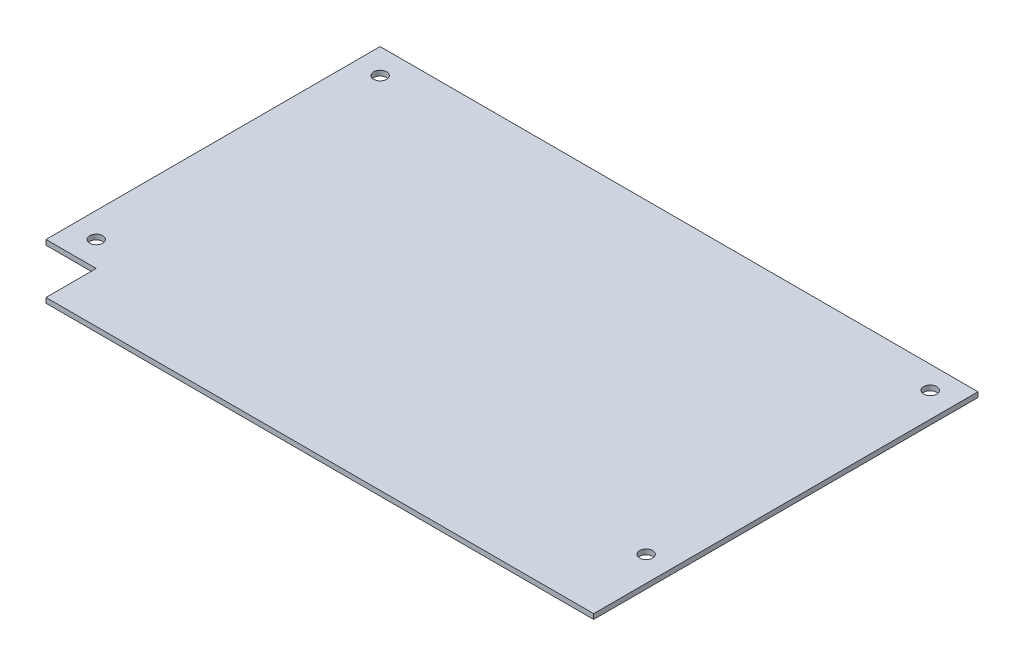
ISO-10303-21;
HEADER;
FILE_DESCRIPTION(('STEP AP214'),'2;1');
FILE_NAME('part.step','',(''),(''),'','','');
FILE_SCHEMA(('AUTOMOTIVE_DESIGN { 1 0 10303 214 1 1 1 1 }'));
ENDSEC;
DATA;
#1=APPLICATION_CONTEXT('core data for automotive mechanical design processes');
#2=APPLICATION_PROTOCOL_DEFINITION('international standard','automotive_design',2000,#1);
#3=PRODUCT_CONTEXT('',#1,'mechanical');
#4=PRODUCT('Part','Part','',(#3));
#5=PRODUCT_RELATED_PRODUCT_CATEGORY('part','',(#4));
#6=PRODUCT_DEFINITION_FORMATION('','',#4);
#7=PRODUCT_DEFINITION_CONTEXT('part definition',#1,'design');
#8=PRODUCT_DEFINITION('design','',#6,#7);
#9=PRODUCT_DEFINITION_SHAPE('','',#8);
#10=(LENGTH_UNIT() NAMED_UNIT(*) SI_UNIT(.MILLI.,.METRE.));
#11=(NAMED_UNIT(*) PLANE_ANGLE_UNIT() SI_UNIT($,.RADIAN.));
#12=(NAMED_UNIT(*) SI_UNIT($,.STERADIAN.) SOLID_ANGLE_UNIT());
#13=UNCERTAINTY_MEASURE_WITH_UNIT(LENGTH_MEASURE(1.E-05),#10,'distance_accuracy_value','');
#14=(GEOMETRIC_REPRESENTATION_CONTEXT(3) GLOBAL_UNCERTAINTY_ASSIGNED_CONTEXT((#13)) GLOBAL_UNIT_ASSIGNED_CONTEXT((#10,
#11,#12)) REPRESENTATION_CONTEXT('',''));
#15=CARTESIAN_POINT('',(0.,0.,0.));
#16=DIRECTION('',(0.,0.,1.));
#17=DIRECTION('',(1.,0.,0.));
#18=AXIS2_PLACEMENT_3D('',#15,#16,#17);
#19=CARTESIAN_POINT('',(-119.,2.,56.5));
#20=DIRECTION('',(1.,0.,0.));
#21=DIRECTION('',(0.,0.,-1.));
#22=AXIS2_PLACEMENT_3D('',#19,#20,#21);
#23=PLANE('',#22);
#24=DIRECTION('',(0.,0.,1.));
#25=VECTOR('',#24,1.);
#26=CARTESIAN_POINT('',(-119.,0.,56.5));
#27=LINE('',#26,#25);
#28=CARTESIAN_POINT('',(-119.,0.,-76.5));
#29=VERTEX_POINT('',#28);
#30=CARTESIAN_POINT('',(-119.,0.,56.5));
#31=VERTEX_POINT('',#30);
#32=EDGE_CURVE('E117',#29,#31,#27,.T.);
#33=ORIENTED_EDGE('',*,*,#32,.T.);
#34=DIRECTION('',(0.,-1.,0.));
#35=VECTOR('',#34,1.);
#36=CARTESIAN_POINT('',(-119.,2.,56.5));
#37=LINE('',#36,#35);
#38=CARTESIAN_POINT('',(-119.,2.,56.5));
#39=VERTEX_POINT('',#38);
#40=EDGE_CURVE('E11',#39,#31,#37,.T.);
#41=ORIENTED_EDGE('',*,*,#40,.F.);
#42=DIRECTION('',(0.,0.,1.));
#43=VECTOR('',#42,1.);
#44=CARTESIAN_POINT('',(-119.,2.,56.5));
#45=LINE('',#44,#43);
#46=CARTESIAN_POINT('',(-119.,2.,-76.5));
#47=VERTEX_POINT('',#46);
#48=EDGE_CURVE('E128',#47,#39,#45,.T.);
#49=ORIENTED_EDGE('',*,*,#48,.F.);
#50=DIRECTION('',(0.,-1.,0.));
#51=VECTOR('',#50,1.);
#52=CARTESIAN_POINT('',(-119.,2.,-76.5));
#53=LINE('',#52,#51);
#54=EDGE_CURVE('E113',#47,#29,#53,.T.);
#55=ORIENTED_EDGE('',*,*,#54,.T.);
#56=EDGE_LOOP('',(#33,#41,#49,#55));
#57=FACE_BOUND('',#56,.T.);
#58=ADVANCED_FACE('F33',(#57),#23,.F.);
#59=CARTESIAN_POINT('',(-119.,2.,56.5));
#60=DIRECTION('',(0.,0.,-1.));
#61=DIRECTION('',(-1.,0.,0.));
#62=AXIS2_PLACEMENT_3D('',#59,#60,#61);
#63=PLANE('',#62);
#64=DIRECTION('',(1.,0.,0.));
#65=VECTOR('',#64,1.);
#66=CARTESIAN_POINT('',(-119.,0.,56.5));
#67=LINE('',#66,#65);
#68=CARTESIAN_POINT('',(-98.9999999999999,0.,56.5));
#69=VERTEX_POINT('',#68);
#70=EDGE_CURVE('E120',#31,#69,#67,.T.);
#71=ORIENTED_EDGE('',*,*,#70,.T.);
#72=DIRECTION('',(0.,-1.,0.));
#73=VECTOR('',#72,1.);
#74=CARTESIAN_POINT('',(-98.9999999999999,2.,56.5));
#75=LINE('',#74,#73);
#76=CARTESIAN_POINT('',(-98.9999999999999,2.,56.5));
#77=VERTEX_POINT('',#76);
#78=EDGE_CURVE('E41',#77,#69,#75,.T.);
#79=ORIENTED_EDGE('',*,*,#78,.F.);
#80=DIRECTION('',(1.,0.,0.));
#81=VECTOR('',#80,1.);
#82=CARTESIAN_POINT('',(-119.,2.,56.5));
#83=LINE('',#82,#81);
#84=EDGE_CURVE('E86',#39,#77,#83,.T.);
#85=ORIENTED_EDGE('',*,*,#84,.F.);
#86=ORIENTED_EDGE('',*,*,#40,.T.);
#87=EDGE_LOOP('',(#71,#79,#85,#86));
#88=FACE_BOUND('',#87,.T.);
#89=ADVANCED_FACE('F154',(#88),#63,.F.);
#90=CARTESIAN_POINT('',(-98.9999999999999,2.,76.5));
#91=DIRECTION('',(1.,0.,0.));
#92=DIRECTION('',(0.,0.,-1.));
#93=AXIS2_PLACEMENT_3D('',#90,#91,#92);
#94=PLANE('',#93);
#95=DIRECTION('',(0.,0.,1.));
#96=VECTOR('',#95,1.);
#97=CARTESIAN_POINT('',(-98.9999999999999,0.,76.5));
#98=LINE('',#97,#96);
#99=CARTESIAN_POINT('',(-98.9999999999999,0.,76.5));
#100=VERTEX_POINT('',#99);
#101=EDGE_CURVE('E123',#69,#100,#98,.T.);
#102=ORIENTED_EDGE('',*,*,#101,.T.);
#103=DIRECTION('',(0.,-1.,0.));
#104=VECTOR('',#103,1.);
#105=CARTESIAN_POINT('',(-98.9999999999999,2.,76.5));
#106=LINE('',#105,#104);
#107=CARTESIAN_POINT('',(-98.9999999999999,2.,76.5));
#108=VERTEX_POINT('',#107);
#109=EDGE_CURVE('E108',#108,#100,#106,.T.);
#110=ORIENTED_EDGE('',*,*,#109,.F.);
#111=DIRECTION('',(0.,0.,1.));
#112=VECTOR('',#111,1.);
#113=CARTESIAN_POINT('',(-98.9999999999999,2.,76.5));
#114=LINE('',#113,#112);
#115=EDGE_CURVE('E99',#77,#108,#114,.T.);
#116=ORIENTED_EDGE('',*,*,#115,.F.);
#117=ORIENTED_EDGE('',*,*,#78,.T.);
#118=EDGE_LOOP('',(#102,#110,#116,#117));
#119=FACE_BOUND('',#118,.T.);
#120=ADVANCED_FACE('F134',(#119),#94,.F.);
#121=CARTESIAN_POINT('',(119.,2.,76.5));
#122=DIRECTION('',(0.,0.,-1.));
#123=DIRECTION('',(-1.,0.,0.));
#124=AXIS2_PLACEMENT_3D('',#121,#122,#123);
#125=PLANE('',#124);
#126=DIRECTION('',(1.,0.,0.));
#127=VECTOR('',#126,1.);
#128=CARTESIAN_POINT('',(119.,0.,76.5));
#129=LINE('',#128,#127);
#130=CARTESIAN_POINT('',(119.,0.,76.5));
#131=VERTEX_POINT('',#130);
#132=EDGE_CURVE('E107',#100,#131,#129,.T.);
#133=ORIENTED_EDGE('',*,*,#132,.T.);
#134=DIRECTION('',(0.,-1.,0.));
#135=VECTOR('',#134,1.);
#136=CARTESIAN_POINT('',(119.,2.,76.5));
#137=LINE('',#136,#135);
#138=CARTESIAN_POINT('',(119.,2.,76.5));
#139=VERTEX_POINT('',#138);
#140=EDGE_CURVE('E104',#139,#131,#137,.T.);
#141=ORIENTED_EDGE('',*,*,#140,.F.);
#142=DIRECTION('',(1.,0.,0.));
#143=VECTOR('',#142,1.);
#144=CARTESIAN_POINT('',(119.,2.,76.5));
#145=LINE('',#144,#143);
#146=EDGE_CURVE('E93',#108,#139,#145,.T.);
#147=ORIENTED_EDGE('',*,*,#146,.F.);
#148=ORIENTED_EDGE('',*,*,#109,.T.);
#149=EDGE_LOOP('',(#133,#141,#147,#148));
#150=FACE_BOUND('',#149,.T.);
#151=ADVANCED_FACE('F105',(#150),#125,.F.);
#152=CARTESIAN_POINT('',(119.,2.,76.5));
#153=DIRECTION('',(-1.,0.,0.));
#154=DIRECTION('',(0.,0.,1.));
#155=AXIS2_PLACEMENT_3D('',#152,#153,#154);
#156=PLANE('',#155);
#157=DIRECTION('',(0.,0.,-1.));
#158=VECTOR('',#157,1.);
#159=CARTESIAN_POINT('',(119.,0.,76.5));
#160=LINE('',#159,#158);
#161=CARTESIAN_POINT('',(119.,0.,-76.5));
#162=VERTEX_POINT('',#161);
#163=EDGE_CURVE('E72',#131,#162,#160,.T.);
#164=ORIENTED_EDGE('',*,*,#163,.T.);
#165=DIRECTION('',(0.,-1.,0.));
#166=VECTOR('',#165,1.);
#167=CARTESIAN_POINT('',(119.,2.,-76.5));
#168=LINE('',#167,#166);
#169=CARTESIAN_POINT('',(119.,2.,-76.5));
#170=VERTEX_POINT('',#169);
#171=EDGE_CURVE('E109',#170,#162,#168,.T.);
#172=ORIENTED_EDGE('',*,*,#171,.F.);
#173=DIRECTION('',(0.,0.,-1.));
#174=VECTOR('',#173,1.);
#175=CARTESIAN_POINT('',(119.,2.,76.5));
#176=LINE('',#175,#174);
#177=EDGE_CURVE('E97',#139,#170,#176,.T.);
#178=ORIENTED_EDGE('',*,*,#177,.F.);
#179=ORIENTED_EDGE('',*,*,#140,.T.);
#180=EDGE_LOOP('',(#164,#172,#178,#179));
#181=FACE_BOUND('',#180,.T.);
#182=ADVANCED_FACE('F111',(#181),#156,.F.);
#183=CARTESIAN_POINT('',(119.,2.,-76.5));
#184=DIRECTION('',(0.,0.,1.));
#185=DIRECTION('',(1.,0.,0.));
#186=AXIS2_PLACEMENT_3D('',#183,#184,#185);
#187=PLANE('',#186);
#188=DIRECTION('',(-1.,0.,0.));
#189=VECTOR('',#188,1.);
#190=CARTESIAN_POINT('',(119.,0.,-76.5));
#191=LINE('',#190,#189);
#192=EDGE_CURVE('E78',#162,#29,#191,.T.);
#193=ORIENTED_EDGE('',*,*,#192,.T.);
#194=ORIENTED_EDGE('',*,*,#54,.F.);
#195=DIRECTION('',(-1.,0.,0.));
#196=VECTOR('',#195,1.);
#197=CARTESIAN_POINT('',(119.,2.,-76.5));
#198=LINE('',#197,#196);
#199=EDGE_CURVE('E49',#170,#47,#198,.T.);
#200=ORIENTED_EDGE('',*,*,#199,.F.);
#201=ORIENTED_EDGE('',*,*,#171,.T.);
#202=EDGE_LOOP('',(#193,#194,#200,#201));
#203=FACE_BOUND('',#202,.T.);
#204=ADVANCED_FACE('F141',(#203),#187,.F.);
#205=CARTESIAN_POINT('',(0.,2.,0.));
#206=DIRECTION('',(0.,1.,0.));
#207=DIRECTION('',(0.,0.,1.));
#208=AXIS2_PLACEMENT_3D('',#205,#206,#207);
#209=PLANE('',#208);
#210=CARTESIAN_POINT('',(-109.,2.,-66.5));
#211=DIRECTION('',(0.,1.,0.));
#212=DIRECTION('',(0.,0.,1.));
#213=AXIS2_PLACEMENT_3D('',#210,#211,#212);
#214=CIRCLE('',#213,2.6);
#215=CARTESIAN_POINT('',(-109.,2.,-63.9));
#216=VERTEX_POINT('',#215);
#217=EDGE_CURVE('E235',#216,#216,#214,.T.);
#218=ORIENTED_EDGE('',*,*,#217,.F.);
#219=EDGE_LOOP('',(#218));
#220=FACE_BOUND('',#219,.T.);
#221=CARTESIAN_POINT('',(-109.,2.,46.5));
#222=DIRECTION('',(0.,1.,0.));
#223=DIRECTION('',(0.,0.,1.));
#224=AXIS2_PLACEMENT_3D('',#221,#222,#223);
#225=CIRCLE('',#224,2.6);
#226=CARTESIAN_POINT('',(-109.,2.,49.1));
#227=VERTEX_POINT('',#226);
#228=EDGE_CURVE('E241',#227,#227,#225,.T.);
#229=ORIENTED_EDGE('',*,*,#228,.F.);
#230=EDGE_LOOP('',(#229));
#231=FACE_BOUND('',#230,.T.);
#232=CARTESIAN_POINT('',(109.,2.,45.6044677173374));
#233=DIRECTION('',(0.,-1.,0.));
#234=DIRECTION('',(0.,0.,-1.));
#235=AXIS2_PLACEMENT_3D('',#232,#233,#234);
#236=CIRCLE('',#235,2.6);
#237=CARTESIAN_POINT('',(109.,2.,43.0044677173374));
#238=VERTEX_POINT('',#237);
#239=EDGE_CURVE('E121',#238,#238,#236,.T.);
#240=ORIENTED_EDGE('',*,*,#239,.T.);
#241=EDGE_LOOP('',(#240));
#242=FACE_BOUND('',#241,.T.);
#243=CARTESIAN_POINT('',(109.,2.,-67.4575480120108));
#244=DIRECTION('',(0.,-1.,0.));
#245=DIRECTION('',(0.,0.,-1.));
#246=AXIS2_PLACEMENT_3D('',#243,#244,#245);
#247=CIRCLE('',#246,2.6);
#248=CARTESIAN_POINT('',(109.,2.,-70.0575480120108));
#249=VERTEX_POINT('',#248);
#250=EDGE_CURVE('E251',#249,#249,#247,.T.);
#251=ORIENTED_EDGE('',*,*,#250,.T.);
#252=EDGE_LOOP('',(#251));
#253=FACE_BOUND('',#252,.T.);
#254=ORIENTED_EDGE('',*,*,#48,.T.);
#255=ORIENTED_EDGE('',*,*,#84,.T.);
#256=ORIENTED_EDGE('',*,*,#115,.T.);
#257=ORIENTED_EDGE('',*,*,#146,.T.);
#258=ORIENTED_EDGE('',*,*,#177,.T.);
#259=ORIENTED_EDGE('',*,*,#199,.T.);
#260=EDGE_LOOP('',(#254,#255,#256,#257,#258,#259));
#261=FACE_BOUND('',#260,.T.);
#262=ADVANCED_FACE('F95',(#220,#231,#242,#253,#261),#209,.T.);
#263=CARTESIAN_POINT('',(0.,0.,0.));
#264=DIRECTION('',(0.,1.,0.));
#265=DIRECTION('',(0.,0.,1.));
#266=AXIS2_PLACEMENT_3D('',#263,#264,#265);
#267=PLANE('',#266);
#268=CARTESIAN_POINT('',(-109.,0.,-66.5));
#269=DIRECTION('',(0.,1.,0.));
#270=DIRECTION('',(0.,0.,1.));
#271=AXIS2_PLACEMENT_3D('',#268,#269,#270);
#272=CIRCLE('',#271,2.6);
#273=CARTESIAN_POINT('',(-109.,0.,-63.9));
#274=VERTEX_POINT('',#273);
#275=EDGE_CURVE('E232',#274,#274,#272,.T.);
#276=ORIENTED_EDGE('',*,*,#275,.T.);
#277=EDGE_LOOP('',(#276));
#278=FACE_BOUND('',#277,.T.);
#279=CARTESIAN_POINT('',(-109.,0.,46.5));
#280=DIRECTION('',(0.,1.,0.));
#281=DIRECTION('',(0.,0.,1.));
#282=AXIS2_PLACEMENT_3D('',#279,#280,#281);
#283=CIRCLE('',#282,2.6);
#284=CARTESIAN_POINT('',(-109.,0.,49.1));
#285=VERTEX_POINT('',#284);
#286=EDGE_CURVE('E236',#285,#285,#283,.T.);
#287=ORIENTED_EDGE('',*,*,#286,.T.);
#288=EDGE_LOOP('',(#287));
#289=FACE_BOUND('',#288,.T.);
#290=CARTESIAN_POINT('',(109.,0.,45.6044677173374));
#291=DIRECTION('',(0.,-1.,0.));
#292=DIRECTION('',(0.,0.,-1.));
#293=AXIS2_PLACEMENT_3D('',#290,#291,#292);
#294=CIRCLE('',#293,2.6);
#295=CARTESIAN_POINT('',(109.,0.,43.0044677173374));
#296=VERTEX_POINT('',#295);
#297=EDGE_CURVE('E248',#296,#296,#294,.T.);
#298=ORIENTED_EDGE('',*,*,#297,.F.);
#299=EDGE_LOOP('',(#298));
#300=FACE_BOUND('',#299,.T.);
#301=CARTESIAN_POINT('',(109.,0.,-67.4575480120108));
#302=DIRECTION('',(0.,-1.,0.));
#303=DIRECTION('',(0.,0.,-1.));
#304=AXIS2_PLACEMENT_3D('',#301,#302,#303);
#305=CIRCLE('',#304,2.6);
#306=CARTESIAN_POINT('',(109.,0.,-70.0575480120108));
#307=VERTEX_POINT('',#306);
#308=EDGE_CURVE('E238',#307,#307,#305,.T.);
#309=ORIENTED_EDGE('',*,*,#308,.F.);
#310=EDGE_LOOP('',(#309));
#311=FACE_BOUND('',#310,.T.);
#312=ORIENTED_EDGE('',*,*,#32,.F.);
#313=ORIENTED_EDGE('',*,*,#192,.F.);
#314=ORIENTED_EDGE('',*,*,#163,.F.);
#315=ORIENTED_EDGE('',*,*,#132,.F.);
#316=ORIENTED_EDGE('',*,*,#101,.F.);
#317=ORIENTED_EDGE('',*,*,#70,.F.);
#318=EDGE_LOOP('',(#312,#313,#314,#315,#316,#317));
#319=FACE_BOUND('',#318,.T.);
#320=ADVANCED_FACE('F137',(#278,#289,#300,#311,#319),#267,.F.);
#321=CARTESIAN_POINT('',(109.,2.,-67.4575480120108));
#322=DIRECTION('',(0.,-1.,0.));
#323=DIRECTION('',(0.,0.,-1.));
#324=AXIS2_PLACEMENT_3D('',#321,#322,#323);
#325=CYLINDRICAL_SURFACE('',#324,2.6);
#326=ORIENTED_EDGE('',*,*,#250,.F.);
#327=EDGE_LOOP('',(#326));
#328=FACE_BOUND('',#327,.T.);
#329=ORIENTED_EDGE('',*,*,#308,.T.);
#330=EDGE_LOOP('',(#329));
#331=FACE_BOUND('',#330,.T.);
#332=ADVANCED_FACE('F182',(#328,#331),#325,.F.);
#333=CARTESIAN_POINT('',(109.,2.,45.6044677173374));
#334=DIRECTION('',(0.,-1.,0.));
#335=DIRECTION('',(0.,0.,-1.));
#336=AXIS2_PLACEMENT_3D('',#333,#334,#335);
#337=CYLINDRICAL_SURFACE('',#336,2.6);
#338=ORIENTED_EDGE('',*,*,#239,.F.);
#339=EDGE_LOOP('',(#338));
#340=FACE_BOUND('',#339,.T.);
#341=ORIENTED_EDGE('',*,*,#297,.T.);
#342=EDGE_LOOP('',(#341));
#343=FACE_BOUND('',#342,.T.);
#344=ADVANCED_FACE('F187',(#340,#343),#337,.F.);
#345=CARTESIAN_POINT('',(-109.,0.,46.5));
#346=DIRECTION('',(0.,1.,0.));
#347=DIRECTION('',(0.,0.,1.));
#348=AXIS2_PLACEMENT_3D('',#345,#346,#347);
#349=CYLINDRICAL_SURFACE('',#348,2.6);
#350=ORIENTED_EDGE('',*,*,#286,.F.);
#351=EDGE_LOOP('',(#350));
#352=FACE_BOUND('',#351,.T.);
#353=ORIENTED_EDGE('',*,*,#228,.T.);
#354=EDGE_LOOP('',(#353));
#355=FACE_BOUND('',#354,.T.);
#356=ADVANCED_FACE('F198',(#352,#355),#349,.F.);
#357=CARTESIAN_POINT('',(-109.,0.,-66.5));
#358=DIRECTION('',(0.,1.,0.));
#359=DIRECTION('',(0.,0.,1.));
#360=AXIS2_PLACEMENT_3D('',#357,#358,#359);
#361=CYLINDRICAL_SURFACE('',#360,2.6);
#362=ORIENTED_EDGE('',*,*,#275,.F.);
#363=EDGE_LOOP('',(#362));
#364=FACE_BOUND('',#363,.T.);
#365=ORIENTED_EDGE('',*,*,#217,.T.);
#366=EDGE_LOOP('',(#365));
#367=FACE_BOUND('',#366,.T.);
#368=ADVANCED_FACE('F215',(#364,#367),#361,.F.);
#369=CLOSED_SHELL('',(#58,#89,#120,#151,#182,#204,#262,#320,#332,#344,#356,#368));
#370=MANIFOLD_SOLID_BREP('B2',#369);
#371=ADVANCED_BREP_SHAPE_REPRESENTATION('',(#18,#370),#14);
#372=SHAPE_DEFINITION_REPRESENTATION(#9,#371);
ENDSEC;
END-ISO-10303-21;
